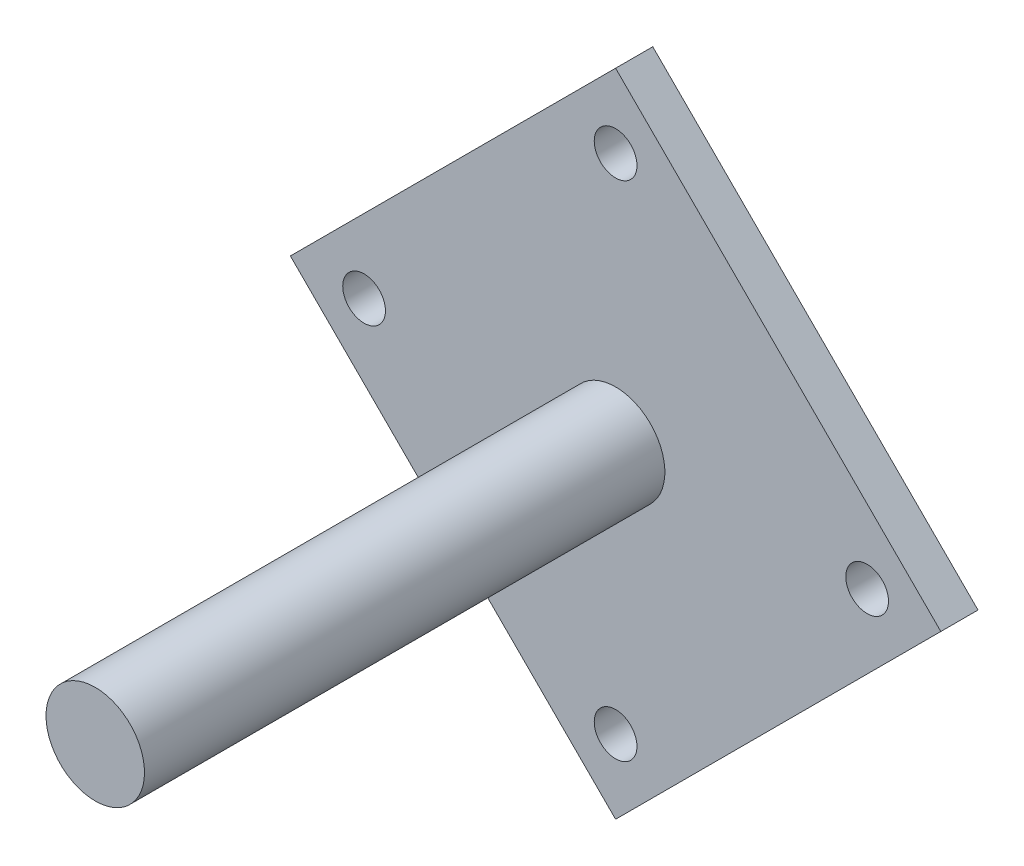
ISO-10303-21;
HEADER;
FILE_DESCRIPTION(('STEP AP214'),'2;1');
FILE_NAME('part.step','',(''),(''),'','','');
FILE_SCHEMA(('AUTOMOTIVE_DESIGN { 1 0 10303 214 1 1 1 1 }'));
ENDSEC;
DATA;
#1=APPLICATION_CONTEXT('core data for automotive mechanical design processes');
#2=APPLICATION_PROTOCOL_DEFINITION('international standard','automotive_design',2000,#1);
#3=PRODUCT_CONTEXT('',#1,'mechanical');
#4=PRODUCT('Part','Part','',(#3));
#5=PRODUCT_RELATED_PRODUCT_CATEGORY('part','',(#4));
#6=PRODUCT_DEFINITION_FORMATION('','',#4);
#7=PRODUCT_DEFINITION_CONTEXT('part definition',#1,'design');
#8=PRODUCT_DEFINITION('design','',#6,#7);
#9=PRODUCT_DEFINITION_SHAPE('','',#8);
#10=(LENGTH_UNIT() NAMED_UNIT(*) SI_UNIT(.MILLI.,.METRE.));
#11=(NAMED_UNIT(*) PLANE_ANGLE_UNIT() SI_UNIT($,.RADIAN.));
#12=(NAMED_UNIT(*) SI_UNIT($,.STERADIAN.) SOLID_ANGLE_UNIT());
#13=UNCERTAINTY_MEASURE_WITH_UNIT(LENGTH_MEASURE(1.E-05),#10,'distance_accuracy_value','');
#14=(GEOMETRIC_REPRESENTATION_CONTEXT(3) GLOBAL_UNCERTAINTY_ASSIGNED_CONTEXT((#13)) GLOBAL_UNIT_ASSIGNED_CONTEXT((#10,
#11,#12)) REPRESENTATION_CONTEXT('',''));
#15=CARTESIAN_POINT('',(0.,0.,0.));
#16=DIRECTION('',(0.,0.,1.));
#17=DIRECTION('',(1.,0.,0.));
#18=AXIS2_PLACEMENT_3D('',#15,#16,#17);
#19=CARTESIAN_POINT('',(0.,0.,2.));
#20=DIRECTION('',(0.,0.,-1.));
#21=DIRECTION('',(-1.,0.,0.));
#22=AXIS2_PLACEMENT_3D('',#19,#20,#21);
#23=PLANE('',#22);
#24=CARTESIAN_POINT('',(-1.41758106618801E-13,13.5337118032324,2.));
#25=DIRECTION('',(0.,0.,-1.));
#26=DIRECTION('',(-1.,0.,0.));
#27=AXIS2_PLACEMENT_3D('',#24,#25,#26);
#28=CIRCLE('',#27,1.15);
#29=CARTESIAN_POINT('',(-1.15000000000014,13.5337118032324,2.));
#30=VERTEX_POINT('',#29);
#31=EDGE_CURVE('E106',#30,#30,#28,.T.);
#32=ORIENTED_EDGE('',*,*,#31,.T.);
#33=EDGE_LOOP('',(#32));
#34=FACE_BOUND('',#33,.T.);
#35=CARTESIAN_POINT('',(13.5337118032324,0.,2.));
#36=DIRECTION('',(0.,0.,-1.));
#37=DIRECTION('',(-1.,0.,0.));
#38=AXIS2_PLACEMENT_3D('',#35,#36,#37);
#39=CIRCLE('',#38,1.15);
#40=CARTESIAN_POINT('',(12.3837118032324,0.,2.));
#41=VERTEX_POINT('',#40);
#42=EDGE_CURVE('E112',#41,#41,#39,.T.);
#43=ORIENTED_EDGE('',*,*,#42,.T.);
#44=EDGE_LOOP('',(#43));
#45=FACE_BOUND('',#44,.T.);
#46=CARTESIAN_POINT('',(0.,-13.5337118032324,2.));
#47=DIRECTION('',(0.,0.,-1.));
#48=DIRECTION('',(-1.,0.,0.));
#49=AXIS2_PLACEMENT_3D('',#46,#47,#48);
#50=CIRCLE('',#49,1.15);
#51=CARTESIAN_POINT('',(-1.14999999999995,-13.5337118032324,2.));
#52=VERTEX_POINT('',#51);
#53=EDGE_CURVE('E118',#52,#52,#50,.T.);
#54=ORIENTED_EDGE('',*,*,#53,.T.);
#55=EDGE_LOOP('',(#54));
#56=FACE_BOUND('',#55,.T.);
#57=CARTESIAN_POINT('',(-13.5337118032324,0.,2.));
#58=DIRECTION('',(0.,0.,-1.));
#59=DIRECTION('',(-1.,0.,0.));
#60=AXIS2_PLACEMENT_3D('',#57,#58,#59);
#61=CIRCLE('',#60,1.15);
#62=CARTESIAN_POINT('',(-14.6837118032324,0.,2.));
#63=VERTEX_POINT('',#62);
#64=EDGE_CURVE('E124',#63,#63,#61,.T.);
#65=ORIENTED_EDGE('',*,*,#64,.T.);
#66=EDGE_LOOP('',(#65));
#67=FACE_BOUND('',#66,.T.);
#68=CARTESIAN_POINT('',(0.,0.,2.));
#69=DIRECTION('',(0.,0.,-1.));
#70=DIRECTION('',(-1.,0.,0.));
#71=AXIS2_PLACEMENT_3D('',#68,#69,#70);
#72=CIRCLE('',#71,2.65);
#73=CARTESIAN_POINT('',(-2.65,0.,2.));
#74=VERTEX_POINT('',#73);
#75=EDGE_CURVE('E130',#74,#74,#72,.T.);
#76=ORIENTED_EDGE('',*,*,#75,.T.);
#77=EDGE_LOOP('',(#76));
#78=FACE_BOUND('',#77,.T.);
#79=DIRECTION('',(0.707106781186548,-0.707106781186548,0.));
#80=VECTOR('',#79,1.);
#81=CARTESIAN_POINT('',(0.,-17.5,2.));
#82=LINE('',#81,#80);
#83=CARTESIAN_POINT('',(-17.5,0.,2.));
#84=VERTEX_POINT('',#83);
#85=CARTESIAN_POINT('',(0.,-17.5,2.));
#86=VERTEX_POINT('',#85);
#87=EDGE_CURVE('E96',#84,#86,#82,.T.);
#88=ORIENTED_EDGE('',*,*,#87,.T.);
#89=DIRECTION('',(0.707106781186548,0.707106781186547,0.));
#90=VECTOR('',#89,1.);
#91=CARTESIAN_POINT('',(17.5,0.,2.));
#92=LINE('',#91,#90);
#93=CARTESIAN_POINT('',(17.5,0.,2.));
#94=VERTEX_POINT('',#93);
#95=EDGE_CURVE('E94',#86,#94,#92,.T.);
#96=ORIENTED_EDGE('',*,*,#95,.T.);
#97=DIRECTION('',(-0.707106781186548,0.707106781186548,0.));
#98=VECTOR('',#97,1.);
#99=CARTESIAN_POINT('',(0.,17.5,2.));
#100=LINE('',#99,#98);
#101=CARTESIAN_POINT('',(0.,17.5,2.));
#102=VERTEX_POINT('',#101);
#103=EDGE_CURVE('E51',#94,#102,#100,.T.);
#104=ORIENTED_EDGE('',*,*,#103,.T.);
#105=DIRECTION('',(-0.707106781186548,-0.707106781186548,0.));
#106=VECTOR('',#105,1.);
#107=CARTESIAN_POINT('',(-17.5,0.,2.));
#108=LINE('',#107,#106);
#109=EDGE_CURVE('E86',#102,#84,#108,.T.);
#110=ORIENTED_EDGE('',*,*,#109,.T.);
#111=EDGE_LOOP('',(#88,#96,#104,#110));
#112=FACE_BOUND('',#111,.T.);
#113=ADVANCED_FACE('F36',(#34,#45,#56,#67,#78,#112),#23,.F.);
#114=CARTESIAN_POINT('',(0.,0.,0.));
#115=DIRECTION('',(0.,0.,1.));
#116=DIRECTION('',(1.,0.,0.));
#117=AXIS2_PLACEMENT_3D('',#114,#115,#116);
#118=PLANE('',#117);
#119=CARTESIAN_POINT('',(-1.41758106618801E-13,13.5337118032324,0.));
#120=DIRECTION('',(0.,0.,-1.));
#121=DIRECTION('',(-1.,0.,0.));
#122=AXIS2_PLACEMENT_3D('',#119,#120,#121);
#123=CIRCLE('',#122,1.15);
#124=CARTESIAN_POINT('',(-1.15000000000014,13.5337118032324,0.));
#125=VERTEX_POINT('',#124);
#126=EDGE_CURVE('E100',#125,#125,#123,.T.);
#127=ORIENTED_EDGE('',*,*,#126,.F.);
#128=EDGE_LOOP('',(#127));
#129=FACE_BOUND('',#128,.T.);
#130=CARTESIAN_POINT('',(13.5337118032324,0.,0.));
#131=DIRECTION('',(0.,0.,-1.));
#132=DIRECTION('',(-1.,0.,0.));
#133=AXIS2_PLACEMENT_3D('',#130,#131,#132);
#134=CIRCLE('',#133,1.15);
#135=CARTESIAN_POINT('',(12.3837118032324,0.,0.));
#136=VERTEX_POINT('',#135);
#137=EDGE_CURVE('E109',#136,#136,#134,.T.);
#138=ORIENTED_EDGE('',*,*,#137,.F.);
#139=EDGE_LOOP('',(#138));
#140=FACE_BOUND('',#139,.T.);
#141=CARTESIAN_POINT('',(0.,-13.5337118032324,0.));
#142=DIRECTION('',(0.,0.,-1.));
#143=DIRECTION('',(-1.,0.,0.));
#144=AXIS2_PLACEMENT_3D('',#141,#142,#143);
#145=CIRCLE('',#144,1.15);
#146=CARTESIAN_POINT('',(-1.14999999999995,-13.5337118032324,0.));
#147=VERTEX_POINT('',#146);
#148=EDGE_CURVE('E115',#147,#147,#145,.T.);
#149=ORIENTED_EDGE('',*,*,#148,.F.);
#150=EDGE_LOOP('',(#149));
#151=FACE_BOUND('',#150,.T.);
#152=CARTESIAN_POINT('',(-13.5337118032324,0.,0.));
#153=DIRECTION('',(0.,0.,-1.));
#154=DIRECTION('',(-1.,0.,0.));
#155=AXIS2_PLACEMENT_3D('',#152,#153,#154);
#156=CIRCLE('',#155,1.15);
#157=CARTESIAN_POINT('',(-14.6837118032324,0.,0.));
#158=VERTEX_POINT('',#157);
#159=EDGE_CURVE('E121',#158,#158,#156,.T.);
#160=ORIENTED_EDGE('',*,*,#159,.F.);
#161=EDGE_LOOP('',(#160));
#162=FACE_BOUND('',#161,.T.);
#163=DIRECTION('',(0.707106781186548,-0.707106781186548,0.));
#164=VECTOR('',#163,1.);
#165=CARTESIAN_POINT('',(-8.75,-8.75,0.));
#166=LINE('',#165,#164);
#167=CARTESIAN_POINT('',(-17.5,0.,0.));
#168=VERTEX_POINT('',#167);
#169=CARTESIAN_POINT('',(0.,-17.5,0.));
#170=VERTEX_POINT('',#169);
#171=EDGE_CURVE('E12',#168,#170,#166,.T.);
#172=ORIENTED_EDGE('',*,*,#171,.F.);
#173=DIRECTION('',(-0.707106781186548,-0.707106781186548,0.));
#174=VECTOR('',#173,1.);
#175=CARTESIAN_POINT('',(-8.75,8.75,0.));
#176=LINE('',#175,#174);
#177=CARTESIAN_POINT('',(0.,17.5,0.));
#178=VERTEX_POINT('',#177);
#179=EDGE_CURVE('E44',#178,#168,#176,.T.);
#180=ORIENTED_EDGE('',*,*,#179,.F.);
#181=DIRECTION('',(-0.707106781186548,0.707106781186548,0.));
#182=VECTOR('',#181,1.);
#183=CARTESIAN_POINT('',(8.75,8.75,0.));
#184=LINE('',#183,#182);
#185=CARTESIAN_POINT('',(17.5,0.,0.));
#186=VERTEX_POINT('',#185);
#187=EDGE_CURVE('E79',#186,#178,#184,.T.);
#188=ORIENTED_EDGE('',*,*,#187,.F.);
#189=DIRECTION('',(0.707106781186548,0.707106781186547,0.));
#190=VECTOR('',#189,1.);
#191=CARTESIAN_POINT('',(8.75,-8.75,0.));
#192=LINE('',#191,#190);
#193=EDGE_CURVE('E133',#170,#186,#192,.T.);
#194=ORIENTED_EDGE('',*,*,#193,.F.);
#195=EDGE_LOOP('',(#172,#180,#188,#194));
#196=FACE_BOUND('',#195,.T.);
#197=ADVANCED_FACE('F140',(#129,#140,#151,#162,#196),#118,.F.);
#198=CARTESIAN_POINT('',(0.,0.,30.));
#199=DIRECTION('',(0.,0.,-1.));
#200=DIRECTION('',(-1.,0.,0.));
#201=AXIS2_PLACEMENT_3D('',#198,#199,#200);
#202=CYLINDRICAL_SURFACE('',#201,2.65);
#203=CARTESIAN_POINT('',(0.,0.,30.));
#204=DIRECTION('',(0.,0.,1.));
#205=DIRECTION('',(1.,0.,0.));
#206=AXIS2_PLACEMENT_3D('',#203,#204,#205);
#207=CIRCLE('',#206,2.65);
#208=CARTESIAN_POINT('',(2.65,0.,30.));
#209=VERTEX_POINT('',#208);
#210=EDGE_CURVE('E127',#209,#209,#207,.T.);
#211=ORIENTED_EDGE('',*,*,#210,.F.);
#212=EDGE_LOOP('',(#211));
#213=FACE_BOUND('',#212,.T.);
#214=ORIENTED_EDGE('',*,*,#75,.F.);
#215=EDGE_LOOP('',(#214));
#216=FACE_BOUND('',#215,.T.);
#217=ADVANCED_FACE('F38',(#213,#216),#202,.T.);
#218=CARTESIAN_POINT('',(0.,0.,30.));
#219=DIRECTION('',(0.,0.,1.));
#220=DIRECTION('',(1.,0.,0.));
#221=AXIS2_PLACEMENT_3D('',#218,#219,#220);
#222=PLANE('',#221);
#223=ORIENTED_EDGE('',*,*,#210,.T.);
#224=EDGE_LOOP('',(#223));
#225=FACE_BOUND('',#224,.T.);
#226=ADVANCED_FACE('F161',(#225),#222,.T.);
#227=CARTESIAN_POINT('',(-13.5337118032324,0.,5.));
#228=DIRECTION('',(0.,0.,-1.));
#229=DIRECTION('',(-1.,0.,0.));
#230=AXIS2_PLACEMENT_3D('',#227,#228,#229);
#231=CYLINDRICAL_SURFACE('',#230,1.15);
#232=ORIENTED_EDGE('',*,*,#159,.T.);
#233=EDGE_LOOP('',(#232));
#234=FACE_BOUND('',#233,.T.);
#235=ORIENTED_EDGE('',*,*,#64,.F.);
#236=EDGE_LOOP('',(#235));
#237=FACE_BOUND('',#236,.T.);
#238=ADVANCED_FACE('F159',(#234,#237),#231,.F.);
#239=CARTESIAN_POINT('',(0.,-13.5337118032324,5.));
#240=DIRECTION('',(0.,0.,-1.));
#241=DIRECTION('',(-1.,0.,0.));
#242=AXIS2_PLACEMENT_3D('',#239,#240,#241);
#243=CYLINDRICAL_SURFACE('',#242,1.15);
#244=ORIENTED_EDGE('',*,*,#148,.T.);
#245=EDGE_LOOP('',(#244));
#246=FACE_BOUND('',#245,.T.);
#247=ORIENTED_EDGE('',*,*,#53,.F.);
#248=EDGE_LOOP('',(#247));
#249=FACE_BOUND('',#248,.T.);
#250=ADVANCED_FACE('F168',(#246,#249),#243,.F.);
#251=CARTESIAN_POINT('',(13.5337118032324,0.,5.));
#252=DIRECTION('',(0.,0.,-1.));
#253=DIRECTION('',(-1.,0.,0.));
#254=AXIS2_PLACEMENT_3D('',#251,#252,#253);
#255=CYLINDRICAL_SURFACE('',#254,1.15);
#256=ORIENTED_EDGE('',*,*,#137,.T.);
#257=EDGE_LOOP('',(#256));
#258=FACE_BOUND('',#257,.T.);
#259=ORIENTED_EDGE('',*,*,#42,.F.);
#260=EDGE_LOOP('',(#259));
#261=FACE_BOUND('',#260,.T.);
#262=ADVANCED_FACE('F219',(#258,#261),#255,.F.);
#263=CARTESIAN_POINT('',(-1.41758106618801E-13,13.5337118032324,5.));
#264=DIRECTION('',(0.,0.,-1.));
#265=DIRECTION('',(-1.,0.,0.));
#266=AXIS2_PLACEMENT_3D('',#263,#264,#265);
#267=CYLINDRICAL_SURFACE('',#266,1.15);
#268=ORIENTED_EDGE('',*,*,#126,.T.);
#269=EDGE_LOOP('',(#268));
#270=FACE_BOUND('',#269,.T.);
#271=ORIENTED_EDGE('',*,*,#31,.F.);
#272=EDGE_LOOP('',(#271));
#273=FACE_BOUND('',#272,.T.);
#274=ADVANCED_FACE('F195',(#270,#273),#267,.F.);
#275=CARTESIAN_POINT('',(0.,-17.5,-3.));
#276=DIRECTION('',(-0.707106781186548,-0.707106781186548,0.));
#277=DIRECTION('',(0.707106781186548,-0.707106781186548,0.));
#278=AXIS2_PLACEMENT_3D('',#275,#276,#277);
#279=PLANE('',#278);
#280=ORIENTED_EDGE('',*,*,#171,.T.);
#281=DIRECTION('',(0.,0.,1.));
#282=VECTOR('',#281,1.);
#283=CARTESIAN_POINT('',(0.,-17.5,-3.));
#284=LINE('',#283,#282);
#285=EDGE_CURVE('E59',#170,#86,#284,.T.);
#286=ORIENTED_EDGE('',*,*,#285,.T.);
#287=ORIENTED_EDGE('',*,*,#87,.F.);
#288=DIRECTION('',(0.,0.,1.));
#289=VECTOR('',#288,1.);
#290=CARTESIAN_POINT('',(-17.5,0.,-3.));
#291=LINE('',#290,#289);
#292=EDGE_CURVE('E82',#168,#84,#291,.T.);
#293=ORIENTED_EDGE('',*,*,#292,.F.);
#294=EDGE_LOOP('',(#280,#286,#287,#293));
#295=FACE_BOUND('',#294,.T.);
#296=ADVANCED_FACE('F138',(#295),#279,.T.);
#297=CARTESIAN_POINT('',(-17.5,0.,-3.));
#298=DIRECTION('',(-0.707106781186548,0.707106781186548,0.));
#299=DIRECTION('',(-0.707106781186548,-0.707106781186548,0.));
#300=AXIS2_PLACEMENT_3D('',#297,#298,#299);
#301=PLANE('',#300);
#302=ORIENTED_EDGE('',*,*,#179,.T.);
#303=ORIENTED_EDGE('',*,*,#292,.T.);
#304=ORIENTED_EDGE('',*,*,#109,.F.);
#305=DIRECTION('',(0.,0.,1.));
#306=VECTOR('',#305,1.);
#307=CARTESIAN_POINT('',(0.,17.5,-3.));
#308=LINE('',#307,#306);
#309=EDGE_CURVE('E75',#178,#102,#308,.T.);
#310=ORIENTED_EDGE('',*,*,#309,.F.);
#311=EDGE_LOOP('',(#302,#303,#304,#310));
#312=FACE_BOUND('',#311,.T.);
#313=ADVANCED_FACE('F87',(#312),#301,.T.);
#314=CARTESIAN_POINT('',(0.,17.5,-3.));
#315=DIRECTION('',(0.707106781186548,0.707106781186548,0.));
#316=DIRECTION('',(-0.707106781186548,0.707106781186548,0.));
#317=AXIS2_PLACEMENT_3D('',#314,#315,#316);
#318=PLANE('',#317);
#319=ORIENTED_EDGE('',*,*,#187,.T.);
#320=ORIENTED_EDGE('',*,*,#309,.T.);
#321=ORIENTED_EDGE('',*,*,#103,.F.);
#322=DIRECTION('',(0.,0.,1.));
#323=VECTOR('',#322,1.);
#324=CARTESIAN_POINT('',(17.5,0.,-3.));
#325=LINE('',#324,#323);
#326=EDGE_CURVE('E83',#186,#94,#325,.T.);
#327=ORIENTED_EDGE('',*,*,#326,.F.);
#328=EDGE_LOOP('',(#319,#320,#321,#327));
#329=FACE_BOUND('',#328,.T.);
#330=ADVANCED_FACE('F77',(#329),#318,.T.);
#331=CARTESIAN_POINT('',(17.5,0.,-3.));
#332=DIRECTION('',(0.707106781186547,-0.707106781186548,0.));
#333=DIRECTION('',(0.707106781186548,0.707106781186547,0.));
#334=AXIS2_PLACEMENT_3D('',#331,#332,#333);
#335=PLANE('',#334);
#336=ORIENTED_EDGE('',*,*,#193,.T.);
#337=ORIENTED_EDGE('',*,*,#326,.T.);
#338=ORIENTED_EDGE('',*,*,#95,.F.);
#339=ORIENTED_EDGE('',*,*,#285,.F.);
#340=EDGE_LOOP('',(#336,#337,#338,#339));
#341=FACE_BOUND('',#340,.T.);
#342=ADVANCED_FACE('F141',(#341),#335,.T.);
#343=CLOSED_SHELL('',(#113,#197,#217,#226,#238,#250,#262,#274,#296,#313,#330,#342));
#344=MANIFOLD_SOLID_BREP('B2',#343);
#345=ADVANCED_BREP_SHAPE_REPRESENTATION('',(#18,#344),#14);
#346=SHAPE_DEFINITION_REPRESENTATION(#9,#345);
ENDSEC;
END-ISO-10303-21;
